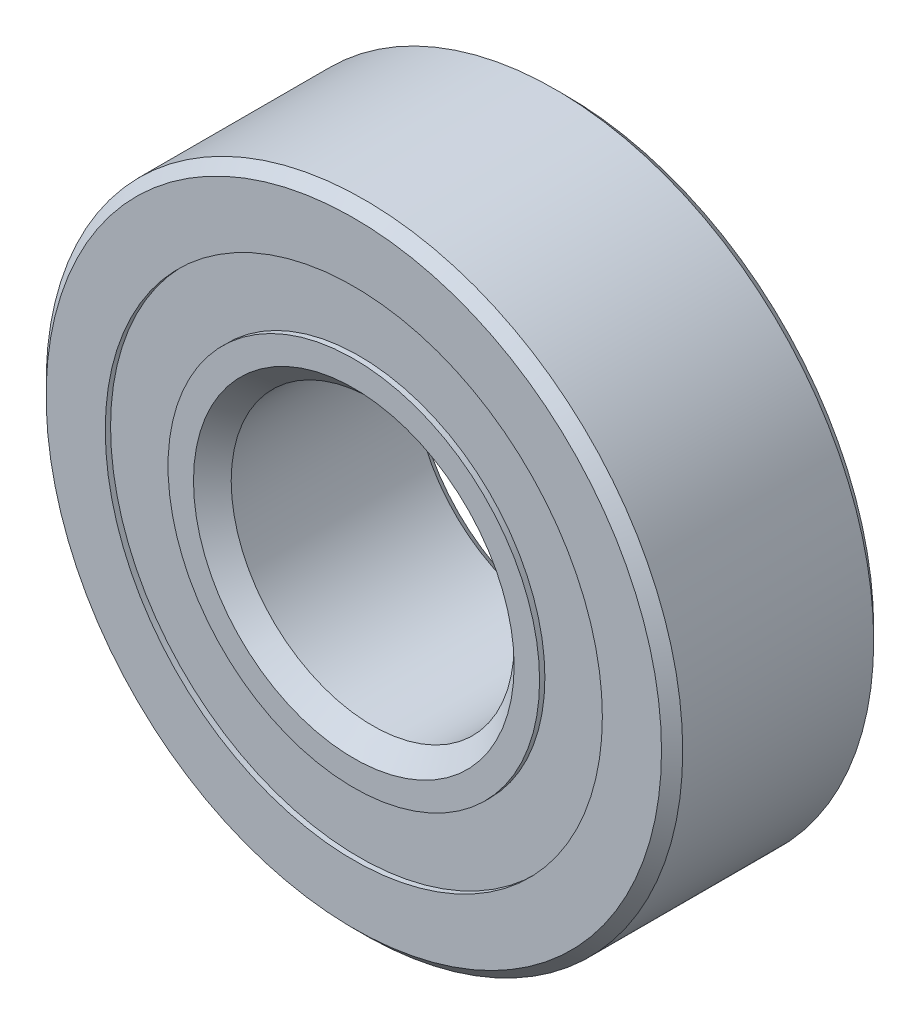
ISO-10303-21;
HEADER;
FILE_DESCRIPTION(('STEP AP214'),'2;1');
FILE_NAME('part.step','',(''),(''),'','','');
FILE_SCHEMA(('AUTOMOTIVE_DESIGN { 1 0 10303 214 1 1 1 1 }'));
ENDSEC;
DATA;
#1=APPLICATION_CONTEXT('core data for automotive mechanical design processes');
#2=APPLICATION_PROTOCOL_DEFINITION('international standard','automotive_design',2000,#1);
#3=PRODUCT_CONTEXT('',#1,'mechanical');
#4=PRODUCT('Part','Part','',(#3));
#5=PRODUCT_RELATED_PRODUCT_CATEGORY('part','',(#4));
#6=PRODUCT_DEFINITION_FORMATION('','',#4);
#7=PRODUCT_DEFINITION_CONTEXT('part definition',#1,'design');
#8=PRODUCT_DEFINITION('design','',#6,#7);
#9=PRODUCT_DEFINITION_SHAPE('','',#8);
#10=(LENGTH_UNIT() NAMED_UNIT(*) SI_UNIT(.MILLI.,.METRE.));
#11=(NAMED_UNIT(*) PLANE_ANGLE_UNIT() SI_UNIT($,.RADIAN.));
#12=(NAMED_UNIT(*) SI_UNIT($,.STERADIAN.) SOLID_ANGLE_UNIT());
#13=UNCERTAINTY_MEASURE_WITH_UNIT(LENGTH_MEASURE(1.E-05),#10,'distance_accuracy_value','');
#14=(GEOMETRIC_REPRESENTATION_CONTEXT(3) GLOBAL_UNCERTAINTY_ASSIGNED_CONTEXT((#13)) GLOBAL_UNIT_ASSIGNED_CONTEXT((#10,
#11,#12)) REPRESENTATION_CONTEXT('',''));
#15=CARTESIAN_POINT('',(0.,0.,0.));
#16=DIRECTION('',(0.,0.,1.));
#17=DIRECTION('',(1.,0.,0.));
#18=AXIS2_PLACEMENT_3D('',#15,#16,#17);
#19=CARTESIAN_POINT('',(0.,11.1561126373626,-4.524375));
#20=DIRECTION('',(0.,0.,1.));
#21=DIRECTION('',(1.,0.,0.));
#22=AXIS2_PLACEMENT_3D('',#19,#20,#21);
#23=PLANE('',#22);
#24=CARTESIAN_POINT('',(0.,0.,-4.524375));
#25=DIRECTION('',(0.,0.,1.));
#26=DIRECTION('',(1.,0.,0.));
#27=AXIS2_PLACEMENT_3D('',#24,#25,#26);
#28=CIRCLE('',#27,11.1561126373626);
#29=CARTESIAN_POINT('',(11.1561126373626,0.,-4.524375));
#30=VERTEX_POINT('',#29);
#31=EDGE_CURVE('E60',#30,#30,#28,.T.);
#32=ORIENTED_EDGE('',*,*,#31,.F.);
#33=EDGE_LOOP('',(#32));
#34=FACE_BOUND('',#33,.T.);
#35=CARTESIAN_POINT('',(0.,0.,-4.524375));
#36=DIRECTION('',(0.,0.,1.));
#37=DIRECTION('',(1.,0.,0.));
#38=AXIS2_PLACEMENT_3D('',#35,#36,#37);
#39=CIRCLE('',#38,8.33881099868363);
#40=CARTESIAN_POINT('',(8.33881099868363,0.,-4.524375));
#41=VERTEX_POINT('',#40);
#42=EDGE_CURVE('E11',#41,#41,#39,.T.);
#43=ORIENTED_EDGE('',*,*,#42,.T.);
#44=EDGE_LOOP('',(#43));
#45=FACE_BOUND('',#44,.T.);
#46=ADVANCED_FACE('F46',(#34,#45),#23,.F.);
#47=CARTESIAN_POINT('',(0.,0.,4.7625));
#48=DIRECTION('',(0.,0.,1.));
#49=DIRECTION('',(1.,0.,0.));
#50=AXIS2_PLACEMENT_3D('',#47,#48,#49);
#51=CYLINDRICAL_SURFACE('',#50,8.33881099868363);
#52=ORIENTED_EDGE('',*,*,#42,.F.);
#53=EDGE_LOOP('',(#52));
#54=FACE_BOUND('',#53,.T.);
#55=CARTESIAN_POINT('',(0.,0.,-2.27628073054021));
#56=DIRECTION('',(0.,0.,1.));
#57=DIRECTION('',(1.,0.,0.));
#58=AXIS2_PLACEMENT_3D('',#55,#56,#57);
#59=CIRCLE('',#58,8.33881099868363);
#60=CARTESIAN_POINT('',(8.33881099868363,0.,-2.27628073054021));
#61=VERTEX_POINT('',#60);
#62=EDGE_CURVE('E52',#61,#61,#59,.T.);
#63=ORIENTED_EDGE('',*,*,#62,.T.);
#64=EDGE_LOOP('',(#63));
#65=FACE_BOUND('',#64,.T.);
#66=ADVANCED_FACE('F69',(#54,#65),#51,.F.);
#67=CARTESIAN_POINT('',(0.,11.1561126373626,-2.27628073054021));
#68=DIRECTION('',(0.,0.,-1.));
#69=DIRECTION('',(-1.,0.,0.));
#70=AXIS2_PLACEMENT_3D('',#67,#68,#69);
#71=PLANE('',#70);
#72=ORIENTED_EDGE('',*,*,#62,.F.);
#73=EDGE_LOOP('',(#72));
#74=FACE_BOUND('',#73,.T.);
#75=CARTESIAN_POINT('',(0.,0.,-2.27628073054021));
#76=DIRECTION('',(0.,0.,1.));
#77=DIRECTION('',(1.,0.,0.));
#78=AXIS2_PLACEMENT_3D('',#75,#76,#77);
#79=CIRCLE('',#78,11.1561126373626);
#80=CARTESIAN_POINT('',(11.1561126373626,0.,-2.27628073054021));
#81=VERTEX_POINT('',#80);
#82=EDGE_CURVE('E56',#81,#81,#79,.T.);
#83=ORIENTED_EDGE('',*,*,#82,.T.);
#84=EDGE_LOOP('',(#83));
#85=FACE_BOUND('',#84,.T.);
#86=ADVANCED_FACE('F73',(#74,#85),#71,.F.);
#87=CARTESIAN_POINT('',(0.,0.,4.7625));
#88=DIRECTION('',(0.,0.,1.));
#89=DIRECTION('',(1.,0.,0.));
#90=AXIS2_PLACEMENT_3D('',#87,#88,#89);
#91=CYLINDRICAL_SURFACE('',#90,11.1561126373626);
#92=ORIENTED_EDGE('',*,*,#82,.F.);
#93=EDGE_LOOP('',(#92));
#94=FACE_BOUND('',#93,.T.);
#95=ORIENTED_EDGE('',*,*,#31,.T.);
#96=EDGE_LOOP('',(#95));
#97=FACE_BOUND('',#96,.T.);
#98=ADVANCED_FACE('F66',(#94,#97),#91,.T.);
#99=CLOSED_SHELL('',(#46,#66,#86,#98));
#100=MANIFOLD_SOLID_BREP('B2',#99);
#101=CARTESIAN_POINT('',(0.,11.1561126373626,4.524375));
#102=DIRECTION('',(0.,0.,-1.));
#103=DIRECTION('',(-1.,0.,0.));
#104=AXIS2_PLACEMENT_3D('',#101,#102,#103);
#105=PLANE('',#104);
#106=CARTESIAN_POINT('',(0.,0.,4.524375));
#107=DIRECTION('',(0.,0.,1.));
#108=DIRECTION('',(1.,0.,0.));
#109=AXIS2_PLACEMENT_3D('',#106,#107,#108);
#110=CIRCLE('',#109,8.33881099868363);
#111=CARTESIAN_POINT('',(8.33881099868363,0.,4.524375));
#112=VERTEX_POINT('',#111);
#113=EDGE_CURVE('E45',#112,#112,#110,.T.);
#114=ORIENTED_EDGE('',*,*,#113,.F.);
#115=EDGE_LOOP('',(#114));
#116=FACE_BOUND('',#115,.T.);
#117=CARTESIAN_POINT('',(0.,0.,4.524375));
#118=DIRECTION('',(0.,0.,1.));
#119=DIRECTION('',(1.,0.,0.));
#120=AXIS2_PLACEMENT_3D('',#117,#118,#119);
#121=CIRCLE('',#120,11.1561126373626);
#122=CARTESIAN_POINT('',(11.1561126373626,0.,4.524375));
#123=VERTEX_POINT('',#122);
#124=EDGE_CURVE('E128',#123,#123,#121,.T.);
#125=ORIENTED_EDGE('',*,*,#124,.T.);
#126=EDGE_LOOP('',(#125));
#127=FACE_BOUND('',#126,.T.);
#128=ADVANCED_FACE('F114',(#116,#127),#105,.F.);
#129=CARTESIAN_POINT('',(0.,0.,4.7625));
#130=DIRECTION('',(0.,0.,1.));
#131=DIRECTION('',(1.,0.,0.));
#132=AXIS2_PLACEMENT_3D('',#129,#130,#131);
#133=CYLINDRICAL_SURFACE('',#132,8.33881099868363);
#134=CARTESIAN_POINT('',(0.,0.,2.27628073054021));
#135=DIRECTION('',(0.,0.,1.));
#136=DIRECTION('',(1.,0.,0.));
#137=AXIS2_PLACEMENT_3D('',#134,#135,#136);
#138=CIRCLE('',#137,8.33881099868363);
#139=CARTESIAN_POINT('',(8.33881099868363,0.,2.27628073054021));
#140=VERTEX_POINT('',#139);
#141=EDGE_CURVE('E120',#140,#140,#138,.T.);
#142=ORIENTED_EDGE('',*,*,#141,.F.);
#143=EDGE_LOOP('',(#142));
#144=FACE_BOUND('',#143,.T.);
#145=ORIENTED_EDGE('',*,*,#113,.T.);
#146=EDGE_LOOP('',(#145));
#147=FACE_BOUND('',#146,.T.);
#148=ADVANCED_FACE('F143',(#144,#147),#133,.F.);
#149=CARTESIAN_POINT('',(0.,11.1561126373626,2.27628073054021));
#150=DIRECTION('',(0.,0.,1.));
#151=DIRECTION('',(1.,0.,0.));
#152=AXIS2_PLACEMENT_3D('',#149,#150,#151);
#153=PLANE('',#152);
#154=CARTESIAN_POINT('',(0.,0.,2.27628073054021));
#155=DIRECTION('',(0.,0.,1.));
#156=DIRECTION('',(1.,0.,0.));
#157=AXIS2_PLACEMENT_3D('',#154,#155,#156);
#158=CIRCLE('',#157,11.1561126373626);
#159=CARTESIAN_POINT('',(11.1561126373626,0.,2.27628073054021));
#160=VERTEX_POINT('',#159);
#161=EDGE_CURVE('E124',#160,#160,#158,.T.);
#162=ORIENTED_EDGE('',*,*,#161,.F.);
#163=EDGE_LOOP('',(#162));
#164=FACE_BOUND('',#163,.T.);
#165=ORIENTED_EDGE('',*,*,#141,.T.);
#166=EDGE_LOOP('',(#165));
#167=FACE_BOUND('',#166,.T.);
#168=ADVANCED_FACE('F138',(#164,#167),#153,.F.);
#169=CARTESIAN_POINT('',(0.,0.,4.7625));
#170=DIRECTION('',(0.,0.,1.));
#171=DIRECTION('',(1.,0.,0.));
#172=AXIS2_PLACEMENT_3D('',#169,#170,#171);
#173=CYLINDRICAL_SURFACE('',#172,11.1561126373626);
#174=ORIENTED_EDGE('',*,*,#124,.F.);
#175=EDGE_LOOP('',(#174));
#176=FACE_BOUND('',#175,.T.);
#177=ORIENTED_EDGE('',*,*,#161,.T.);
#178=EDGE_LOOP('',(#177));
#179=FACE_BOUND('',#178,.T.);
#180=ADVANCED_FACE('F135',(#176,#179),#173,.T.);
#181=CLOSED_SHELL('',(#128,#148,#168,#180));
#182=MANIFOLD_SOLID_BREP('B6',#181);
#183=CARTESIAN_POINT('',(-6.06520907209285,8.34804411070657,0.));
#184=DIRECTION('',(0.,0.,1.));
#185=DIRECTION('',(-0.587785252292462,0.809016994374955,0.));
#186=AXIS2_PLACEMENT_3D('',#183,#184,#185);
#187=SPHERICAL_SURFACE('',#186,2.27628073054021);
#188=CARTESIAN_POINT('',(-6.06520907209285,8.34804411070657,2.27628073054021));
#189=VERTEX_POINT('',#188);
#190=VERTEX_LOOP('',#189);
#191=FACE_BOUND('',#190,.T.);
#192=ADVANCED_FACE('F196',(#191),#187,.T.);
#193=CLOSED_SHELL('',(#192));
#194=MANIFOLD_SOLID_BREP('B40',#193);
#195=CARTESIAN_POINT('',(-9.81371442752058,3.1886691107066,0.));
#196=DIRECTION('',(0.,0.,1.));
#197=DIRECTION('',(-0.95105651629515,0.309016994374958,0.));
#198=AXIS2_PLACEMENT_3D('',#195,#196,#197);
#199=SPHERICAL_SURFACE('',#198,2.27628073054021);
#200=CARTESIAN_POINT('',(-9.81371442752058,3.1886691107066,2.27628073054021));
#201=VERTEX_POINT('',#200);
#202=VERTEX_LOOP('',#201);
#203=FACE_BOUND('',#202,.T.);
#204=ADVANCED_FACE('F229',(#203),#199,.T.);
#205=CLOSED_SHELL('',(#204));
#206=MANIFOLD_SOLID_BREP('B110',#205);
#207=CARTESIAN_POINT('',(-9.81371442752065,-3.18866911070639,0.));
#208=DIRECTION('',(0.,0.,1.));
#209=DIRECTION('',(-0.951056516295157,-0.309016994374938,0.));
#210=AXIS2_PLACEMENT_3D('',#207,#208,#209);
#211=SPHERICAL_SURFACE('',#210,2.27628073054021);
#212=CARTESIAN_POINT('',(-9.81371442752065,-3.18866911070639,2.27628073054021));
#213=VERTEX_POINT('',#212);
#214=VERTEX_LOOP('',#213);
#215=FACE_BOUND('',#214,.T.);
#216=ADVANCED_FACE('F262',(#215),#211,.T.);
#217=CLOSED_SHELL('',(#216));
#218=MANIFOLD_SOLID_BREP('B192',#217);
#219=CARTESIAN_POINT('',(-6.06520907209303,-8.34804411070643,0.));
#220=DIRECTION('',(0.,0.,1.));
#221=DIRECTION('',(-0.58778525229248,-0.809016994374942,0.));
#222=AXIS2_PLACEMENT_3D('',#219,#220,#221);
#223=SPHERICAL_SURFACE('',#222,2.27628073054021);
#224=CARTESIAN_POINT('',(-6.06520907209303,-8.34804411070643,2.27628073054021));
#225=VERTEX_POINT('',#224);
#226=VERTEX_LOOP('',#225);
#227=FACE_BOUND('',#226,.T.);
#228=ADVANCED_FACE('F296',(#227),#223,.T.);
#229=CLOSED_SHELL('',(#228));
#230=MANIFOLD_SOLID_BREP('B225',#229);
#231=CARTESIAN_POINT('',(0.,-10.31875,0.));
#232=DIRECTION('',(0.,0.,1.));
#233=DIRECTION('',(0.,-1.,0.));
#234=AXIS2_PLACEMENT_3D('',#231,#232,#233);
#235=SPHERICAL_SURFACE('',#234,2.27628073054021);
#236=CARTESIAN_POINT('',(0.,-10.31875,2.27628073054021));
#237=VERTEX_POINT('',#236);
#238=VERTEX_LOOP('',#237);
#239=FACE_BOUND('',#238,.T.);
#240=ADVANCED_FACE('F330',(#239),#235,.T.);
#241=CLOSED_SHELL('',(#240));
#242=MANIFOLD_SOLID_BREP('B258',#241);
#243=CARTESIAN_POINT('',(6.06520907209291,-8.34804411070652,0.));
#244=DIRECTION('',(0.,0.,1.));
#245=DIRECTION('',(0.587785252292469,-0.809016994374951,0.));
#246=AXIS2_PLACEMENT_3D('',#243,#244,#245);
#247=SPHERICAL_SURFACE('',#246,2.27628073054021);
#248=CARTESIAN_POINT('',(6.06520907209291,-8.34804411070652,2.27628073054021));
#249=VERTEX_POINT('',#248);
#250=VERTEX_LOOP('',#249);
#251=FACE_BOUND('',#250,.T.);
#252=ADVANCED_FACE('F364',(#251),#247,.T.);
#253=CLOSED_SHELL('',(#252));
#254=MANIFOLD_SOLID_BREP('B292',#253);
#255=CARTESIAN_POINT('',(9.8137144275206,-3.18866911070653,0.));
#256=DIRECTION('',(0.,0.,1.));
#257=DIRECTION('',(0.951056516295152,-0.309016994374952,0.));
#258=AXIS2_PLACEMENT_3D('',#255,#256,#257);
#259=SPHERICAL_SURFACE('',#258,2.27628073054021);
#260=CARTESIAN_POINT('',(9.8137144275206,-3.18866911070653,2.27628073054021));
#261=VERTEX_POINT('',#260);
#262=VERTEX_LOOP('',#261);
#263=FACE_BOUND('',#262,.T.);
#264=ADVANCED_FACE('F398',(#263),#259,.T.);
#265=CLOSED_SHELL('',(#264));
#266=MANIFOLD_SOLID_BREP('B326',#265);
#267=CARTESIAN_POINT('',(9.81371442752063,3.18866911070646,0.));
#268=DIRECTION('',(0.,0.,1.));
#269=DIRECTION('',(0.951056516295155,0.309016994374945,0.));
#270=AXIS2_PLACEMENT_3D('',#267,#268,#269);
#271=SPHERICAL_SURFACE('',#270,2.27628073054021);
#272=CARTESIAN_POINT('',(9.81371442752063,3.18866911070646,2.27628073054021));
#273=VERTEX_POINT('',#272);
#274=VERTEX_LOOP('',#273);
#275=FACE_BOUND('',#274,.T.);
#276=ADVANCED_FACE('F431',(#275),#271,.T.);
#277=CLOSED_SHELL('',(#276));
#278=MANIFOLD_SOLID_BREP('B360',#277);
#279=CARTESIAN_POINT('',(6.06520907209297,8.34804411070648,0.));
#280=DIRECTION('',(0.,0.,1.));
#281=DIRECTION('',(0.587785252292474,0.809016994374947,0.));
#282=AXIS2_PLACEMENT_3D('',#279,#280,#281);
#283=SPHERICAL_SURFACE('',#282,2.27628073054021);
#284=CARTESIAN_POINT('',(6.06520907209297,8.34804411070648,2.27628073054021));
#285=VERTEX_POINT('',#284);
#286=VERTEX_LOOP('',#285);
#287=FACE_BOUND('',#286,.T.);
#288=ADVANCED_FACE('F464',(#287),#283,.T.);
#289=CLOSED_SHELL('',(#288));
#290=MANIFOLD_SOLID_BREP('B394',#289);
#291=CARTESIAN_POINT('',(0.,10.31875,0.));
#292=DIRECTION('',(0.,0.,1.));
#293=DIRECTION('',(0.,1.,0.));
#294=AXIS2_PLACEMENT_3D('',#291,#292,#293);
#295=SPHERICAL_SURFACE('',#294,2.27628073054021);
#296=CARTESIAN_POINT('',(0.,10.31875,2.27628073054021));
#297=VERTEX_POINT('',#296);
#298=VERTEX_LOOP('',#297);
#299=FACE_BOUND('',#298,.T.);
#300=ADVANCED_FACE('F499',(#299),#295,.T.);
#301=CLOSED_SHELL('',(#300));
#302=MANIFOLD_SOLID_BREP('B427',#301);
#303=CARTESIAN_POINT('',(0.,0.,4.7625));
#304=DIRECTION('',(0.,0.,1.));
#305=DIRECTION('',(1.,0.,0.));
#306=AXIS2_PLACEMENT_3D('',#303,#304,#305);
#307=CYLINDRICAL_SURFACE('',#306,8.33881099868363);
#308=CARTESIAN_POINT('',(0.,0.,4.7625));
#309=DIRECTION('',(0.,0.,1.));
#310=DIRECTION('',(1.,0.,0.));
#311=AXIS2_PLACEMENT_3D('',#308,#309,#310);
#312=CIRCLE('',#311,8.33881099868363);
#313=CARTESIAN_POINT('',(8.33881099868363,0.,4.7625));
#314=VERTEX_POINT('',#313);
#315=EDGE_CURVE('E559',#314,#314,#312,.T.);
#316=ORIENTED_EDGE('',*,*,#315,.F.);
#317=EDGE_LOOP('',(#316));
#318=FACE_BOUND('',#317,.T.);
#319=CARTESIAN_POINT('',(0.,0.,4.524375));
#320=DIRECTION('',(0.,0.,1.));
#321=DIRECTION('',(1.,0.,0.));
#322=AXIS2_PLACEMENT_3D('',#319,#320,#321);
#323=CIRCLE('',#322,8.33881099868363);
#324=CARTESIAN_POINT('',(8.33881099868363,0.,4.524375));
#325=VERTEX_POINT('',#324);
#326=EDGE_CURVE('E498',#325,#325,#323,.T.);
#327=ORIENTED_EDGE('',*,*,#326,.T.);
#328=EDGE_LOOP('',(#327));
#329=FACE_BOUND('',#328,.T.);
#330=ADVANCED_FACE('F519',(#318,#329),#307,.T.);
#331=CARTESIAN_POINT('',(0.,8.33881099868363,4.524375));
#332=DIRECTION('',(0.,0.,1.));
#333=DIRECTION('',(1.,0.,0.));
#334=AXIS2_PLACEMENT_3D('',#331,#332,#333);
#335=PLANE('',#334);
#336=ORIENTED_EDGE('',*,*,#326,.F.);
#337=EDGE_LOOP('',(#336));
#338=FACE_BOUND('',#337,.T.);
#339=CARTESIAN_POINT('',(0.,0.,4.524375));
#340=DIRECTION('',(0.,0.,1.));
#341=DIRECTION('',(1.,0.,0.));
#342=AXIS2_PLACEMENT_3D('',#339,#340,#341);
#343=CIRCLE('',#342,8.10068599868363);
#344=CARTESIAN_POINT('',(8.10068599868363,0.,4.524375));
#345=VERTEX_POINT('',#344);
#346=EDGE_CURVE('E525',#345,#345,#343,.T.);
#347=ORIENTED_EDGE('',*,*,#346,.T.);
#348=EDGE_LOOP('',(#347));
#349=FACE_BOUND('',#348,.T.);
#350=ADVANCED_FACE('F566',(#338,#349),#335,.F.);
#351=CARTESIAN_POINT('',(0.,0.,3.61992363604627));
#352=DIRECTION('',(0.,0.,1.));
#353=DIRECTION('',(1.,0.,0.));
#354=AXIS2_PLACEMENT_3D('',#351,#352,#353);
#355=CONICAL_SURFACE('',#354,7.19623463472989,0.78539816339745);
#356=ORIENTED_EDGE('',*,*,#346,.F.);
#357=EDGE_LOOP('',(#356));
#358=FACE_BOUND('',#357,.T.);
#359=CARTESIAN_POINT('',(0.,0.,3.61992363604627));
#360=DIRECTION('',(0.,0.,1.));
#361=DIRECTION('',(1.,0.,0.));
#362=AXIS2_PLACEMENT_3D('',#359,#360,#361);
#363=CIRCLE('',#362,7.19623463472989);
#364=CARTESIAN_POINT('',(7.19623463472989,0.,3.61992363604627));
#365=VERTEX_POINT('',#364);
#366=EDGE_CURVE('E529',#365,#365,#363,.T.);
#367=ORIENTED_EDGE('',*,*,#366,.T.);
#368=EDGE_LOOP('',(#367));
#369=FACE_BOUND('',#368,.T.);
#370=ADVANCED_FACE('F570',(#358,#369),#355,.T.);
#371=CARTESIAN_POINT('',(0.,0.,4.7625));
#372=DIRECTION('',(0.,0.,1.));
#373=DIRECTION('',(1.,0.,0.));
#374=AXIS2_PLACEMENT_3D('',#371,#372,#373);
#375=CYLINDRICAL_SURFACE('',#374,7.19623463472989);
#376=ORIENTED_EDGE('',*,*,#366,.F.);
#377=EDGE_LOOP('',(#376));
#378=FACE_BOUND('',#377,.T.);
#379=CARTESIAN_POINT('',(0.,0.,0.));
#380=DIRECTION('',(0.,0.,1.));
#381=DIRECTION('',(1.,0.,0.));
#382=AXIS2_PLACEMENT_3D('',#379,#380,#381);
#383=CIRCLE('',#382,7.19623463472989);
#384=CARTESIAN_POINT('',(7.19623463472989,0.,0.));
#385=VERTEX_POINT('',#384);
#386=EDGE_CURVE('E533',#385,#385,#383,.T.);
#387=ORIENTED_EDGE('',*,*,#386,.T.);
#388=EDGE_LOOP('',(#387));
#389=FACE_BOUND('',#388,.T.);
#390=ADVANCED_FACE('F575',(#378,#389),#375,.T.);
#391=CARTESIAN_POINT('',(0.,7.19623463472989,0.));
#392=DIRECTION('',(0.,0.,-1.));
#393=DIRECTION('',(-1.,0.,0.));
#394=AXIS2_PLACEMENT_3D('',#391,#392,#393);
#395=PLANE('',#394);
#396=ORIENTED_EDGE('',*,*,#386,.F.);
#397=EDGE_LOOP('',(#396));
#398=FACE_BOUND('',#397,.T.);
#399=CARTESIAN_POINT('',(0.,0.,0.));
#400=DIRECTION('',(0.,0.,1.));
#401=DIRECTION('',(1.,0.,0.));
#402=AXIS2_PLACEMENT_3D('',#399,#400,#401);
#403=CIRCLE('',#402,8.04246926945979);
#404=CARTESIAN_POINT('',(8.04246926945979,0.,0.));
#405=VERTEX_POINT('',#404);
#406=EDGE_CURVE('E538',#405,#405,#403,.T.);
#407=ORIENTED_EDGE('',*,*,#406,.T.);
#408=EDGE_LOOP('',(#407));
#409=FACE_BOUND('',#408,.T.);
#410=ADVANCED_FACE('F581',(#398,#409),#395,.F.);
#411=CARTESIAN_POINT('',(0.,0.,0.));
#412=DIRECTION('',(0.,0.,1.));
#413=DIRECTION('',(1.,0.,0.));
#414=AXIS2_PLACEMENT_3D('',#411,#412,#413);
#415=TOROIDAL_SURFACE('',#414,10.31875,2.27628073054021);
#416=ORIENTED_EDGE('',*,*,#406,.F.);
#417=EDGE_LOOP('',(#416));
#418=FACE_BOUND('',#417,.T.);
#419=CARTESIAN_POINT('',(0.,0.,-2.11666666666667));
#420=DIRECTION('',(0.,0.,1.));
#421=DIRECTION('',(1.,0.,0.));
#422=AXIS2_PLACEMENT_3D('',#419,#420,#421);
#423=CIRCLE('',#422,9.48138736263736);
#424=CARTESIAN_POINT('',(9.48138736263736,0.,-2.11666666666667));
#425=VERTEX_POINT('',#424);
#426=EDGE_CURVE('E541',#425,#425,#423,.T.);
#427=ORIENTED_EDGE('',*,*,#426,.T.);
#428=EDGE_LOOP('',(#427));
#429=FACE_BOUND('',#428,.T.);
#430=ADVANCED_FACE('F585',(#418,#429),#415,.F.);
#431=CARTESIAN_POINT('',(0.,0.,4.7625));
#432=DIRECTION('',(0.,0.,1.));
#433=DIRECTION('',(1.,0.,0.));
#434=AXIS2_PLACEMENT_3D('',#431,#432,#433);
#435=CYLINDRICAL_SURFACE('',#434,9.48138736263736);
#436=ORIENTED_EDGE('',*,*,#426,.F.);
#437=EDGE_LOOP('',(#436));
#438=FACE_BOUND('',#437,.T.);
#439=CARTESIAN_POINT('',(0.,0.,-4.7625));
#440=DIRECTION('',(0.,0.,1.));
#441=DIRECTION('',(1.,0.,0.));
#442=AXIS2_PLACEMENT_3D('',#439,#440,#441);
#443=CIRCLE('',#442,9.48138736263736);
#444=CARTESIAN_POINT('',(9.48138736263736,0.,-4.7625));
#445=VERTEX_POINT('',#444);
#446=EDGE_CURVE('E544',#445,#445,#443,.T.);
#447=ORIENTED_EDGE('',*,*,#446,.T.);
#448=EDGE_LOOP('',(#447));
#449=FACE_BOUND('',#448,.T.);
#450=ADVANCED_FACE('F589',(#438,#449),#435,.T.);
#451=CARTESIAN_POINT('',(0.,6.82625,-4.7625));
#452=DIRECTION('',(0.,0.,1.));
#453=DIRECTION('',(1.,0.,0.));
#454=AXIS2_PLACEMENT_3D('',#451,#452,#453);
#455=PLANE('',#454);
#456=ORIENTED_EDGE('',*,*,#446,.F.);
#457=EDGE_LOOP('',(#456));
#458=FACE_BOUND('',#457,.T.);
#459=CARTESIAN_POINT('',(0.,0.,-4.7625));
#460=DIRECTION('',(0.,0.,1.));
#461=DIRECTION('',(1.,0.,0.));
#462=AXIS2_PLACEMENT_3D('',#459,#460,#461);
#463=CIRCLE('',#462,6.82625);
#464=CARTESIAN_POINT('',(6.82625,0.,-4.7625));
#465=VERTEX_POINT('',#464);
#466=EDGE_CURVE('E547',#465,#465,#463,.T.);
#467=ORIENTED_EDGE('',*,*,#466,.T.);
#468=EDGE_LOOP('',(#467));
#469=FACE_BOUND('',#468,.T.);
#470=ADVANCED_FACE('F593',(#458,#469),#455,.F.);
#471=CARTESIAN_POINT('',(0.,0.,-4.28625));
#472=DIRECTION('',(0.,0.,-1.));
#473=DIRECTION('',(-1.,0.,0.));
#474=AXIS2_PLACEMENT_3D('',#471,#472,#473);
#475=CONICAL_SURFACE('',#474,6.35,0.785398163397448);
#476=ORIENTED_EDGE('',*,*,#466,.F.);
#477=EDGE_LOOP('',(#476));
#478=FACE_BOUND('',#477,.T.);
#479=CARTESIAN_POINT('',(0.,0.,-4.28625));
#480=DIRECTION('',(0.,0.,1.));
#481=DIRECTION('',(1.,0.,0.));
#482=AXIS2_PLACEMENT_3D('',#479,#480,#481);
#483=CIRCLE('',#482,6.35);
#484=CARTESIAN_POINT('',(6.35,0.,-4.28625));
#485=VERTEX_POINT('',#484);
#486=EDGE_CURVE('E550',#485,#485,#483,.T.);
#487=ORIENTED_EDGE('',*,*,#486,.T.);
#488=EDGE_LOOP('',(#487));
#489=FACE_BOUND('',#488,.T.);
#490=ADVANCED_FACE('F597',(#478,#489),#475,.F.);
#491=CARTESIAN_POINT('',(0.,0.,4.7625));
#492=DIRECTION('',(0.,0.,1.));
#493=DIRECTION('',(1.,0.,0.));
#494=AXIS2_PLACEMENT_3D('',#491,#492,#493);
#495=CYLINDRICAL_SURFACE('',#494,6.35);
#496=ORIENTED_EDGE('',*,*,#486,.F.);
#497=EDGE_LOOP('',(#496));
#498=FACE_BOUND('',#497,.T.);
#499=CARTESIAN_POINT('',(0.,0.,3.91626536527011));
#500=DIRECTION('',(0.,0.,1.));
#501=DIRECTION('',(1.,0.,0.));
#502=AXIS2_PLACEMENT_3D('',#499,#500,#501);
#503=CIRCLE('',#502,6.35);
#504=CARTESIAN_POINT('',(6.35,0.,3.91626536527011));
#505=VERTEX_POINT('',#504);
#506=EDGE_CURVE('E553',#505,#505,#503,.T.);
#507=ORIENTED_EDGE('',*,*,#506,.T.);
#508=EDGE_LOOP('',(#507));
#509=FACE_BOUND('',#508,.T.);
#510=ADVANCED_FACE('F601',(#498,#509),#495,.F.);
#511=CARTESIAN_POINT('',(0.,0.,4.7625));
#512=DIRECTION('',(0.,0.,1.));
#513=DIRECTION('',(1.,0.,0.));
#514=AXIS2_PLACEMENT_3D('',#511,#512,#513);
#515=CONICAL_SURFACE('',#514,7.19623463472989,0.78539816339745);
#516=ORIENTED_EDGE('',*,*,#506,.F.);
#517=EDGE_LOOP('',(#516));
#518=FACE_BOUND('',#517,.T.);
#519=CARTESIAN_POINT('',(0.,0.,4.7625));
#520=DIRECTION('',(0.,0.,1.));
#521=DIRECTION('',(1.,0.,0.));
#522=AXIS2_PLACEMENT_3D('',#519,#520,#521);
#523=CIRCLE('',#522,7.19623463472989);
#524=CARTESIAN_POINT('',(7.19623463472989,0.,4.7625));
#525=VERTEX_POINT('',#524);
#526=EDGE_CURVE('E556',#525,#525,#523,.T.);
#527=ORIENTED_EDGE('',*,*,#526,.T.);
#528=EDGE_LOOP('',(#527));
#529=FACE_BOUND('',#528,.T.);
#530=ADVANCED_FACE('F605',(#518,#529),#515,.F.);
#531=CARTESIAN_POINT('',(0.,8.33881099868363,4.7625));
#532=DIRECTION('',(0.,0.,-1.));
#533=DIRECTION('',(-1.,0.,0.));
#534=AXIS2_PLACEMENT_3D('',#531,#532,#533);
#535=PLANE('',#534);
#536=ORIENTED_EDGE('',*,*,#526,.F.);
#537=EDGE_LOOP('',(#536));
#538=FACE_BOUND('',#537,.T.);
#539=ORIENTED_EDGE('',*,*,#315,.T.);
#540=EDGE_LOOP('',(#539));
#541=FACE_BOUND('',#540,.T.);
#542=ADVANCED_FACE('F563',(#538,#541),#535,.F.);
#543=CLOSED_SHELL('',(#330,#350,#370,#390,#410,#430,#450,#470,#490,#510,#530,#542));
#544=MANIFOLD_SOLID_BREP('B460',#543);
#545=CARTESIAN_POINT('',(0.,0.,4.28625));
#546=DIRECTION('',(0.,0.,-1.));
#547=DIRECTION('',(-1.,0.,0.));
#548=AXIS2_PLACEMENT_3D('',#545,#546,#547);
#549=CONICAL_SURFACE('',#548,14.2875,0.785398163397449);
#550=CARTESIAN_POINT('',(0.,0.,4.7625));
#551=DIRECTION('',(0.,0.,1.));
#552=DIRECTION('',(1.,0.,0.));
#553=AXIS2_PLACEMENT_3D('',#550,#551,#552);
#554=CIRCLE('',#553,13.81125);
#555=CARTESIAN_POINT('',(13.81125,0.,4.7625));
#556=VERTEX_POINT('',#555);
#557=EDGE_CURVE('E729',#556,#556,#554,.T.);
#558=ORIENTED_EDGE('',*,*,#557,.F.);
#559=EDGE_LOOP('',(#558));
#560=FACE_BOUND('',#559,.T.);
#561=CARTESIAN_POINT('',(0.,0.,4.28625));
#562=DIRECTION('',(0.,0.,1.));
#563=DIRECTION('',(1.,0.,0.));
#564=AXIS2_PLACEMENT_3D('',#561,#562,#563);
#565=CIRCLE('',#564,14.2875);
#566=CARTESIAN_POINT('',(14.2875,0.,4.28625));
#567=VERTEX_POINT('',#566);
#568=EDGE_CURVE('E518',#567,#567,#565,.T.);
#569=ORIENTED_EDGE('',*,*,#568,.T.);
#570=EDGE_LOOP('',(#569));
#571=FACE_BOUND('',#570,.T.);
#572=ADVANCED_FACE('F701',(#560,#571),#549,.T.);
#573=CARTESIAN_POINT('',(0.,0.,4.7625));
#574=DIRECTION('',(0.,0.,1.));
#575=DIRECTION('',(1.,0.,0.));
#576=AXIS2_PLACEMENT_3D('',#573,#574,#575);
#577=CYLINDRICAL_SURFACE('',#576,14.2875);
#578=ORIENTED_EDGE('',*,*,#568,.F.);
#579=EDGE_LOOP('',(#578));
#580=FACE_BOUND('',#579,.T.);
#581=CARTESIAN_POINT('',(0.,0.,-4.28625));
#582=DIRECTION('',(0.,0.,1.));
#583=DIRECTION('',(1.,0.,0.));
#584=AXIS2_PLACEMENT_3D('',#581,#582,#583);
#585=CIRCLE('',#584,14.2875);
#586=CARTESIAN_POINT('',(14.2875,0.,-4.28625));
#587=VERTEX_POINT('',#586);
#588=EDGE_CURVE('E707',#587,#587,#585,.T.);
#589=ORIENTED_EDGE('',*,*,#588,.T.);
#590=EDGE_LOOP('',(#589));
#591=FACE_BOUND('',#590,.T.);
#592=ADVANCED_FACE('F736',(#580,#591),#577,.T.);
#593=CARTESIAN_POINT('',(0.,0.,-4.7625));
#594=DIRECTION('',(0.,0.,1.));
#595=DIRECTION('',(1.,0.,0.));
#596=AXIS2_PLACEMENT_3D('',#593,#594,#595);
#597=CONICAL_SURFACE('',#596,13.81125,0.785398163397448);
#598=ORIENTED_EDGE('',*,*,#588,.F.);
#599=EDGE_LOOP('',(#598));
#600=FACE_BOUND('',#599,.T.);
#601=CARTESIAN_POINT('',(0.,0.,-4.7625));
#602=DIRECTION('',(0.,0.,1.));
#603=DIRECTION('',(1.,0.,0.));
#604=AXIS2_PLACEMENT_3D('',#601,#602,#603);
#605=CIRCLE('',#604,13.81125);
#606=CARTESIAN_POINT('',(13.81125,0.,-4.7625));
#607=VERTEX_POINT('',#606);
#608=EDGE_CURVE('E711',#607,#607,#605,.T.);
#609=ORIENTED_EDGE('',*,*,#608,.T.);
#610=EDGE_LOOP('',(#609));
#611=FACE_BOUND('',#610,.T.);
#612=ADVANCED_FACE('F740',(#600,#611),#597,.T.);
#613=CARTESIAN_POINT('',(0.,13.81125,-4.7625));
#614=DIRECTION('',(0.,0.,1.));
#615=DIRECTION('',(1.,0.,0.));
#616=AXIS2_PLACEMENT_3D('',#613,#614,#615);
#617=PLANE('',#616);
#618=ORIENTED_EDGE('',*,*,#608,.F.);
#619=EDGE_LOOP('',(#618));
#620=FACE_BOUND('',#619,.T.);
#621=CARTESIAN_POINT('',(0.,0.,-4.7625));
#622=DIRECTION('',(0.,0.,1.));
#623=DIRECTION('',(1.,0.,0.));
#624=AXIS2_PLACEMENT_3D('',#621,#622,#623);
#625=CIRCLE('',#624,11.1561126373626);
#626=CARTESIAN_POINT('',(11.1561126373626,0.,-4.7625));
#627=VERTEX_POINT('',#626);
#628=EDGE_CURVE('E715',#627,#627,#625,.T.);
#629=ORIENTED_EDGE('',*,*,#628,.T.);
#630=EDGE_LOOP('',(#629));
#631=FACE_BOUND('',#630,.T.);
#632=ADVANCED_FACE('F745',(#620,#631),#617,.F.);
#633=CARTESIAN_POINT('',(0.,0.,4.7625));
#634=DIRECTION('',(0.,0.,1.));
#635=DIRECTION('',(1.,0.,0.));
#636=AXIS2_PLACEMENT_3D('',#633,#634,#635);
#637=CYLINDRICAL_SURFACE('',#636,11.1561126373626);
#638=ORIENTED_EDGE('',*,*,#628,.F.);
#639=EDGE_LOOP('',(#638));
#640=FACE_BOUND('',#639,.T.);
#641=CARTESIAN_POINT('',(0.,0.,-2.11666666666667));
#642=DIRECTION('',(0.,0.,1.));
#643=DIRECTION('',(1.,0.,0.));
#644=AXIS2_PLACEMENT_3D('',#641,#642,#643);
#645=CIRCLE('',#644,11.1561126373626);
#646=CARTESIAN_POINT('',(11.1561126373626,0.,-2.11666666666667));
#647=VERTEX_POINT('',#646);
#648=EDGE_CURVE('E720',#647,#647,#645,.T.);
#649=ORIENTED_EDGE('',*,*,#648,.T.);
#650=EDGE_LOOP('',(#649));
#651=FACE_BOUND('',#650,.T.);
#652=ADVANCED_FACE('F751',(#640,#651),#637,.F.);
#653=CARTESIAN_POINT('',(0.,0.,0.));
#654=DIRECTION('',(0.,0.,1.));
#655=DIRECTION('',(1.,0.,0.));
#656=AXIS2_PLACEMENT_3D('',#653,#654,#655);
#657=TOROIDAL_SURFACE('',#656,10.31875,2.27628073054021);
#658=ORIENTED_EDGE('',*,*,#648,.F.);
#659=EDGE_LOOP('',(#658));
#660=FACE_BOUND('',#659,.T.);
#661=CARTESIAN_POINT('',(0.,0.,2.11666666666667));
#662=DIRECTION('',(0.,0.,1.));
#663=DIRECTION('',(1.,0.,0.));
#664=AXIS2_PLACEMENT_3D('',#661,#662,#663);
#665=CIRCLE('',#664,11.1561126373626);
#666=CARTESIAN_POINT('',(11.1561126373626,0.,2.11666666666667));
#667=VERTEX_POINT('',#666);
#668=EDGE_CURVE('E723',#667,#667,#665,.T.);
#669=ORIENTED_EDGE('',*,*,#668,.T.);
#670=EDGE_LOOP('',(#669));
#671=FACE_BOUND('',#670,.T.);
#672=ADVANCED_FACE('F755',(#660,#671),#657,.F.);
#673=CARTESIAN_POINT('',(0.,0.,4.7625));
#674=DIRECTION('',(0.,0.,1.));
#675=DIRECTION('',(1.,0.,0.));
#676=AXIS2_PLACEMENT_3D('',#673,#674,#675);
#677=CYLINDRICAL_SURFACE('',#676,11.1561126373626);
#678=ORIENTED_EDGE('',*,*,#668,.F.);
#679=EDGE_LOOP('',(#678));
#680=FACE_BOUND('',#679,.T.);
#681=CARTESIAN_POINT('',(0.,0.,4.7625));
#682=DIRECTION('',(0.,0.,1.));
#683=DIRECTION('',(1.,0.,0.));
#684=AXIS2_PLACEMENT_3D('',#681,#682,#683);
#685=CIRCLE('',#684,11.1561126373626);
#686=CARTESIAN_POINT('',(11.1561126373626,0.,4.7625));
#687=VERTEX_POINT('',#686);
#688=EDGE_CURVE('E726',#687,#687,#685,.T.);
#689=ORIENTED_EDGE('',*,*,#688,.T.);
#690=EDGE_LOOP('',(#689));
#691=FACE_BOUND('',#690,.T.);
#692=ADVANCED_FACE('F759',(#680,#691),#677,.F.);
#693=CARTESIAN_POINT('',(0.,13.81125,4.7625));
#694=DIRECTION('',(0.,0.,-1.));
#695=DIRECTION('',(-1.,0.,0.));
#696=AXIS2_PLACEMENT_3D('',#693,#694,#695);
#697=PLANE('',#696);
#698=ORIENTED_EDGE('',*,*,#688,.F.);
#699=EDGE_LOOP('',(#698));
#700=FACE_BOUND('',#699,.T.);
#701=ORIENTED_EDGE('',*,*,#557,.T.);
#702=EDGE_LOOP('',(#701));
#703=FACE_BOUND('',#702,.T.);
#704=ADVANCED_FACE('F733',(#700,#703),#697,.F.);
#705=CLOSED_SHELL('',(#572,#592,#612,#632,#652,#672,#692,#704));
#706=MANIFOLD_SOLID_BREP('B493',#705);
#707=ADVANCED_BREP_SHAPE_REPRESENTATION('',(#18,#100,#182,#194,#206,#218,#230,#242,#254,#266,
#278,#290,#302,#544,#706),#14);
#708=SHAPE_DEFINITION_REPRESENTATION(#9,#707);
ENDSEC;
END-ISO-10303-21;
